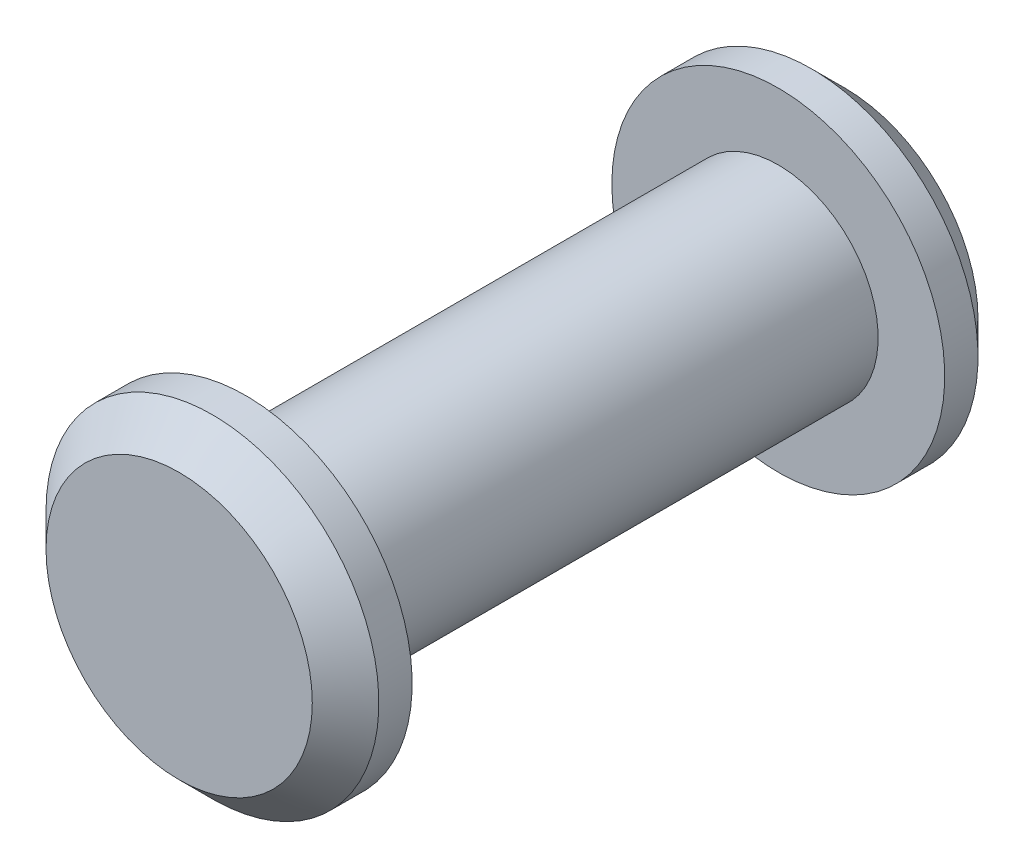
ISO-10303-21;
HEADER;
FILE_DESCRIPTION(('STEP AP214'),'2;1');
FILE_NAME('part.step','',(''),(''),'','','');
FILE_SCHEMA(('AUTOMOTIVE_DESIGN { 1 0 10303 214 1 1 1 1 }'));
ENDSEC;
DATA;
#1=APPLICATION_CONTEXT('core data for automotive mechanical design processes');
#2=APPLICATION_PROTOCOL_DEFINITION('international standard','automotive_design',2000,#1);
#3=PRODUCT_CONTEXT('',#1,'mechanical');
#4=PRODUCT('Part','Part','',(#3));
#5=PRODUCT_RELATED_PRODUCT_CATEGORY('part','',(#4));
#6=PRODUCT_DEFINITION_FORMATION('','',#4);
#7=PRODUCT_DEFINITION_CONTEXT('part definition',#1,'design');
#8=PRODUCT_DEFINITION('design','',#6,#7);
#9=PRODUCT_DEFINITION_SHAPE('','',#8);
#10=(LENGTH_UNIT() NAMED_UNIT(*) SI_UNIT(.MILLI.,.METRE.));
#11=(NAMED_UNIT(*) PLANE_ANGLE_UNIT() SI_UNIT($,.RADIAN.));
#12=(NAMED_UNIT(*) SI_UNIT($,.STERADIAN.) SOLID_ANGLE_UNIT());
#13=UNCERTAINTY_MEASURE_WITH_UNIT(LENGTH_MEASURE(1.E-05),#10,'distance_accuracy_value','');
#14=(GEOMETRIC_REPRESENTATION_CONTEXT(3) GLOBAL_UNCERTAINTY_ASSIGNED_CONTEXT((#13)) GLOBAL_UNIT_ASSIGNED_CONTEXT((#10,
#11,#12)) REPRESENTATION_CONTEXT('',''));
#15=CARTESIAN_POINT('',(0.,0.,0.));
#16=DIRECTION('',(0.,0.,1.));
#17=DIRECTION('',(1.,0.,0.));
#18=AXIS2_PLACEMENT_3D('',#15,#16,#17);
#19=CARTESIAN_POINT('',(0.,0.,20.));
#20=DIRECTION('',(0.,0.,-1.));
#21=DIRECTION('',(-1.,0.,0.));
#22=AXIS2_PLACEMENT_3D('',#19,#20,#21);
#23=PLANE('',#22);
#24=CARTESIAN_POINT('',(0.,0.,20.));
#25=DIRECTION('',(0.,0.,-1.));
#26=DIRECTION('',(-1.,0.,0.));
#27=AXIS2_PLACEMENT_3D('',#24,#25,#26);
#28=CIRCLE('',#27,8.);
#29=CARTESIAN_POINT('',(-7.99999999999999,0.,20.));
#30=VERTEX_POINT('',#29);
#31=EDGE_CURVE('E10',#30,#30,#28,.T.);
#32=ORIENTED_EDGE('',*,*,#31,.F.);
#33=EDGE_LOOP('',(#32));
#34=FACE_BOUND('',#33,.T.);
#35=ADVANCED_FACE('F31',(#34),#23,.F.);
#36=CARTESIAN_POINT('',(0.,0.,20.));
#37=DIRECTION('',(0.,0.,-1.));
#38=DIRECTION('',(-1.,0.,0.));
#39=AXIS2_PLACEMENT_3D('',#36,#37,#38);
#40=CONICAL_SURFACE('',#39,8.,0.78539816339745);
#41=CARTESIAN_POINT('',(0.,0.,18.));
#42=DIRECTION('',(0.,0.,-1.));
#43=DIRECTION('',(-1.,0.,0.));
#44=AXIS2_PLACEMENT_3D('',#41,#42,#43);
#45=CIRCLE('',#44,10.);
#46=CARTESIAN_POINT('',(-10.,0.,18.));
#47=VERTEX_POINT('',#46);
#48=EDGE_CURVE('E37',#47,#47,#45,.T.);
#49=ORIENTED_EDGE('',*,*,#48,.F.);
#50=EDGE_LOOP('',(#49));
#51=FACE_BOUND('',#50,.T.);
#52=ORIENTED_EDGE('',*,*,#31,.T.);
#53=EDGE_LOOP('',(#52));
#54=FACE_BOUND('',#53,.T.);
#55=ADVANCED_FACE('F97',(#51,#54),#40,.T.);
#56=CARTESIAN_POINT('',(0.,0.,-20.));
#57=DIRECTION('',(0.,0.,-1.));
#58=DIRECTION('',(-1.,0.,0.));
#59=AXIS2_PLACEMENT_3D('',#56,#57,#58);
#60=CYLINDRICAL_SURFACE('',#59,10.);
#61=CARTESIAN_POINT('',(0.,0.,16.));
#62=DIRECTION('',(0.,0.,-1.));
#63=DIRECTION('',(-1.,0.,0.));
#64=AXIS2_PLACEMENT_3D('',#61,#62,#63);
#65=CIRCLE('',#64,10.);
#66=CARTESIAN_POINT('',(-9.99999999999999,0.,16.));
#67=VERTEX_POINT('',#66);
#68=EDGE_CURVE('E41',#67,#67,#65,.T.);
#69=ORIENTED_EDGE('',*,*,#68,.F.);
#70=EDGE_LOOP('',(#69));
#71=FACE_BOUND('',#70,.T.);
#72=ORIENTED_EDGE('',*,*,#48,.T.);
#73=EDGE_LOOP('',(#72));
#74=FACE_BOUND('',#73,.T.);
#75=ADVANCED_FACE('F92',(#71,#74),#60,.T.);
#76=CARTESIAN_POINT('',(10.,0.,16.));
#77=DIRECTION('',(0.,0.,1.));
#78=DIRECTION('',(1.,0.,0.));
#79=AXIS2_PLACEMENT_3D('',#76,#77,#78);
#80=PLANE('',#79);
#81=CARTESIAN_POINT('',(0.,0.,16.));
#82=DIRECTION('',(0.,0.,-1.));
#83=DIRECTION('',(-1.,0.,0.));
#84=AXIS2_PLACEMENT_3D('',#81,#82,#83);
#85=CIRCLE('',#84,6.);
#86=CARTESIAN_POINT('',(-6.,0.,16.));
#87=VERTEX_POINT('',#86);
#88=EDGE_CURVE('E45',#87,#87,#85,.T.);
#89=ORIENTED_EDGE('',*,*,#88,.F.);
#90=EDGE_LOOP('',(#89));
#91=FACE_BOUND('',#90,.T.);
#92=ORIENTED_EDGE('',*,*,#68,.T.);
#93=EDGE_LOOP('',(#92));
#94=FACE_BOUND('',#93,.T.);
#95=ADVANCED_FACE('F86',(#91,#94),#80,.F.);
#96=CARTESIAN_POINT('',(0.,0.,-20.));
#97=DIRECTION('',(0.,0.,-1.));
#98=DIRECTION('',(-1.,0.,0.));
#99=AXIS2_PLACEMENT_3D('',#96,#97,#98);
#100=CYLINDRICAL_SURFACE('',#99,6.);
#101=CARTESIAN_POINT('',(0.,0.,-16.));
#102=DIRECTION('',(0.,0.,-1.));
#103=DIRECTION('',(-1.,0.,0.));
#104=AXIS2_PLACEMENT_3D('',#101,#102,#103);
#105=CIRCLE('',#104,6.00000000000001);
#106=CARTESIAN_POINT('',(-6.00000000000001,0.,-16.));
#107=VERTEX_POINT('',#106);
#108=EDGE_CURVE('E50',#107,#107,#105,.T.);
#109=ORIENTED_EDGE('',*,*,#108,.F.);
#110=EDGE_LOOP('',(#109));
#111=FACE_BOUND('',#110,.T.);
#112=ORIENTED_EDGE('',*,*,#88,.T.);
#113=EDGE_LOOP('',(#112));
#114=FACE_BOUND('',#113,.T.);
#115=ADVANCED_FACE('F80',(#111,#114),#100,.T.);
#116=CARTESIAN_POINT('',(10.,0.,-16.));
#117=DIRECTION('',(0.,0.,-1.));
#118=DIRECTION('',(-1.,0.,0.));
#119=AXIS2_PLACEMENT_3D('',#116,#117,#118);
#120=PLANE('',#119);
#121=CARTESIAN_POINT('',(0.,0.,-16.));
#122=DIRECTION('',(0.,0.,-1.));
#123=DIRECTION('',(-1.,0.,0.));
#124=AXIS2_PLACEMENT_3D('',#121,#122,#123);
#125=CIRCLE('',#124,10.);
#126=CARTESIAN_POINT('',(-10.,0.,-16.));
#127=VERTEX_POINT('',#126);
#128=EDGE_CURVE('E53',#127,#127,#125,.T.);
#129=ORIENTED_EDGE('',*,*,#128,.F.);
#130=EDGE_LOOP('',(#129));
#131=FACE_BOUND('',#130,.T.);
#132=ORIENTED_EDGE('',*,*,#108,.T.);
#133=EDGE_LOOP('',(#132));
#134=FACE_BOUND('',#133,.T.);
#135=ADVANCED_FACE('F74',(#131,#134),#120,.F.);
#136=CARTESIAN_POINT('',(0.,0.,-20.));
#137=DIRECTION('',(0.,0.,-1.));
#138=DIRECTION('',(-1.,0.,0.));
#139=AXIS2_PLACEMENT_3D('',#136,#137,#138);
#140=CYLINDRICAL_SURFACE('',#139,10.);
#141=CARTESIAN_POINT('',(0.,0.,-18.));
#142=DIRECTION('',(0.,0.,-1.));
#143=DIRECTION('',(-1.,0.,0.));
#144=AXIS2_PLACEMENT_3D('',#141,#142,#143);
#145=CIRCLE('',#144,10.);
#146=CARTESIAN_POINT('',(-10.,0.,-18.));
#147=VERTEX_POINT('',#146);
#148=EDGE_CURVE('E56',#147,#147,#145,.T.);
#149=ORIENTED_EDGE('',*,*,#148,.F.);
#150=EDGE_LOOP('',(#149));
#151=FACE_BOUND('',#150,.T.);
#152=ORIENTED_EDGE('',*,*,#128,.T.);
#153=EDGE_LOOP('',(#152));
#154=FACE_BOUND('',#153,.T.);
#155=ADVANCED_FACE('F68',(#151,#154),#140,.T.);
#156=CARTESIAN_POINT('',(0.,0.,-18.));
#157=DIRECTION('',(0.,0.,1.));
#158=DIRECTION('',(1.,0.,0.));
#159=AXIS2_PLACEMENT_3D('',#156,#157,#158);
#160=CONICAL_SURFACE('',#159,10.,0.78539816339745);
#161=CARTESIAN_POINT('',(0.,0.,-20.));
#162=DIRECTION('',(0.,0.,-1.));
#163=DIRECTION('',(-1.,0.,0.));
#164=AXIS2_PLACEMENT_3D('',#161,#162,#163);
#165=CIRCLE('',#164,8.);
#166=CARTESIAN_POINT('',(-8.00000000000001,0.,-20.));
#167=VERTEX_POINT('',#166);
#168=EDGE_CURVE('E59',#167,#167,#165,.T.);
#169=ORIENTED_EDGE('',*,*,#168,.F.);
#170=EDGE_LOOP('',(#169));
#171=FACE_BOUND('',#170,.T.);
#172=ORIENTED_EDGE('',*,*,#148,.T.);
#173=EDGE_LOOP('',(#172));
#174=FACE_BOUND('',#173,.T.);
#175=ADVANCED_FACE('F65',(#171,#174),#160,.T.);
#176=CARTESIAN_POINT('',(0.,0.,-20.));
#177=DIRECTION('',(0.,0.,1.));
#178=DIRECTION('',(1.,0.,0.));
#179=AXIS2_PLACEMENT_3D('',#176,#177,#178);
#180=PLANE('',#179);
#181=ORIENTED_EDGE('',*,*,#168,.T.);
#182=EDGE_LOOP('',(#181));
#183=FACE_BOUND('',#182,.T.);
#184=ADVANCED_FACE('F63',(#183),#180,.F.);
#185=CLOSED_SHELL('',(#35,#55,#75,#95,#115,#135,#155,#175,#184));
#186=MANIFOLD_SOLID_BREP('B2',#185);
#187=ADVANCED_BREP_SHAPE_REPRESENTATION('',(#18,#186),#14);
#188=SHAPE_DEFINITION_REPRESENTATION(#9,#187);
ENDSEC;
END-ISO-10303-21;
